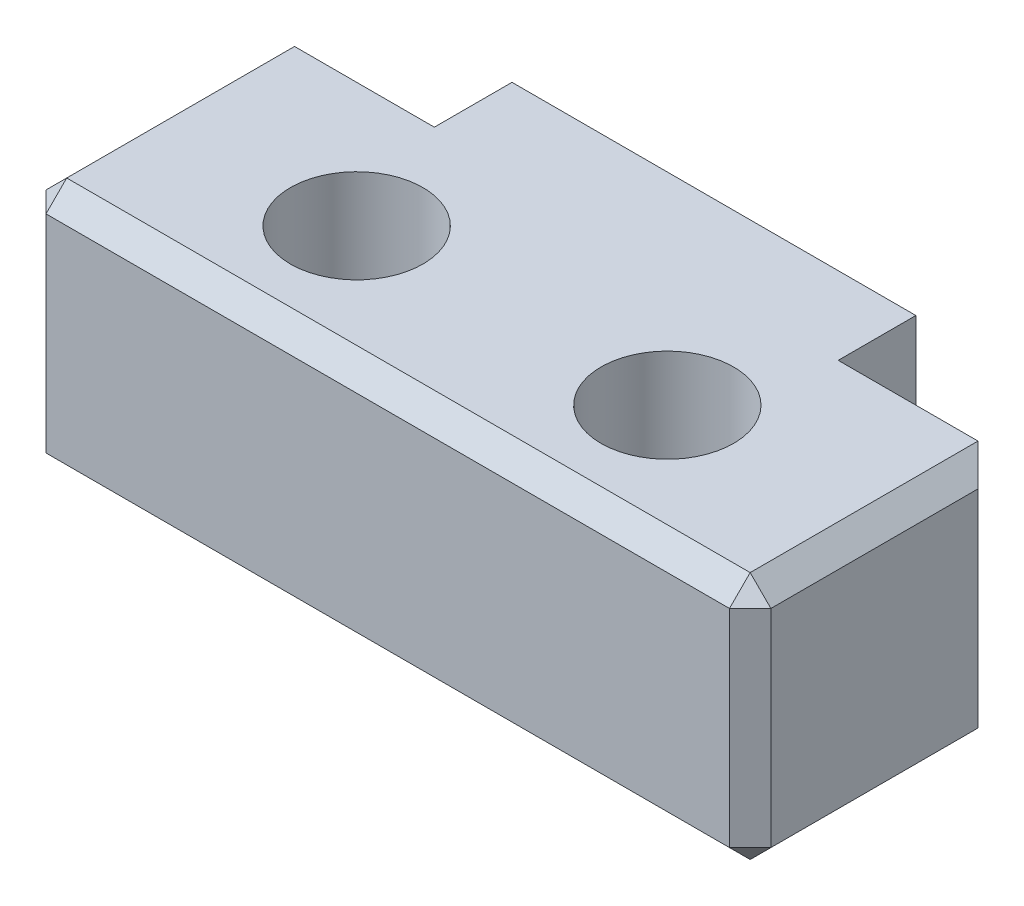
ISO-10303-21;
HEADER;
FILE_DESCRIPTION(('STEP AP214'),'2;1');
FILE_NAME('part.step','',(''),(''),'','','');
FILE_SCHEMA(('AUTOMOTIVE_DESIGN { 1 0 10303 214 1 1 1 1 }'));
ENDSEC;
DATA;
#1=APPLICATION_CONTEXT('core data for automotive mechanical design processes');
#2=APPLICATION_PROTOCOL_DEFINITION('international standard','automotive_design',2000,#1);
#3=PRODUCT_CONTEXT('',#1,'mechanical');
#4=PRODUCT('Part','Part','',(#3));
#5=PRODUCT_RELATED_PRODUCT_CATEGORY('part','',(#4));
#6=PRODUCT_DEFINITION_FORMATION('','',#4);
#7=PRODUCT_DEFINITION_CONTEXT('part definition',#1,'design');
#8=PRODUCT_DEFINITION('design','',#6,#7);
#9=PRODUCT_DEFINITION_SHAPE('','',#8);
#10=(LENGTH_UNIT() NAMED_UNIT(*) SI_UNIT(.MILLI.,.METRE.));
#11=(NAMED_UNIT(*) PLANE_ANGLE_UNIT() SI_UNIT($,.RADIAN.));
#12=(NAMED_UNIT(*) SI_UNIT($,.STERADIAN.) SOLID_ANGLE_UNIT());
#13=UNCERTAINTY_MEASURE_WITH_UNIT(LENGTH_MEASURE(1.E-05),#10,'distance_accuracy_value','');
#14=(GEOMETRIC_REPRESENTATION_CONTEXT(3) GLOBAL_UNCERTAINTY_ASSIGNED_CONTEXT((#13)) GLOBAL_UNIT_ASSIGNED_CONTEXT((#10,
#11,#12)) REPRESENTATION_CONTEXT('',''));
#15=CARTESIAN_POINT('',(0.,0.,0.));
#16=DIRECTION('',(0.,0.,1.));
#17=DIRECTION('',(1.,0.,0.));
#18=AXIS2_PLACEMENT_3D('',#15,#16,#17);
#19=CARTESIAN_POINT('',(0.,0.,-6.));
#20=DIRECTION('',(0.,0.,-1.));
#21=DIRECTION('',(-1.,0.,0.));
#22=AXIS2_PLACEMENT_3D('',#19,#20,#21);
#23=PLANE('',#22);
#24=DIRECTION('',(-1.,0.,0.));
#25=VECTOR('',#24,1.);
#26=CARTESIAN_POINT('',(-17.5,6.,-6.));
#27=LINE('',#26,#25);
#28=CARTESIAN_POINT('',(16.5,6.,-6.));
#29=VERTEX_POINT('',#28);
#30=CARTESIAN_POINT('',(9.75,6.,-6.));
#31=VERTEX_POINT('',#30);
#32=EDGE_CURVE('E178',#29,#31,#27,.T.);
#33=ORIENTED_EDGE('',*,*,#32,.F.);
#34=DIRECTION('',(0.,-1.,0.));
#35=VECTOR('',#34,1.);
#36=CARTESIAN_POINT('',(16.5,-6.,-6.));
#37=LINE('',#36,#35);
#38=CARTESIAN_POINT('',(16.5,-6.,-6.));
#39=VERTEX_POINT('',#38);
#40=EDGE_CURVE('E211',#29,#39,#37,.T.);
#41=ORIENTED_EDGE('',*,*,#40,.T.);
#42=DIRECTION('',(1.,0.,0.));
#43=VECTOR('',#42,1.);
#44=CARTESIAN_POINT('',(-17.5,-6.,-6.));
#45=LINE('',#44,#43);
#46=CARTESIAN_POINT('',(9.75,-6.,-6.));
#47=VERTEX_POINT('',#46);
#48=EDGE_CURVE('E190',#47,#39,#45,.T.);
#49=ORIENTED_EDGE('',*,*,#48,.F.);
#50=DIRECTION('',(0.,1.,0.));
#51=VECTOR('',#50,1.);
#52=CARTESIAN_POINT('',(9.75,-26.0701893364263,-6.));
#53=LINE('',#52,#51);
#54=EDGE_CURVE('E183',#47,#31,#53,.T.);
#55=ORIENTED_EDGE('',*,*,#54,.T.);
#56=EDGE_LOOP('',(#33,#41,#49,#55));
#57=FACE_BOUND('',#56,.T.);
#58=ADVANCED_FACE('F41',(#57),#23,.T.);
#59=CARTESIAN_POINT('',(17.5,-6.,6.));
#60=DIRECTION('',(-1.,0.,0.));
#61=DIRECTION('',(0.,0.,1.));
#62=AXIS2_PLACEMENT_3D('',#59,#60,#61);
#63=PLANE('',#62);
#64=DIRECTION('',(0.,-1.,0.));
#65=VECTOR('',#64,1.);
#66=CARTESIAN_POINT('',(17.5,-6.,5.));
#67=LINE('',#66,#65);
#68=CARTESIAN_POINT('',(17.5,4.99999999999999,5.));
#69=VERTEX_POINT('',#68);
#70=CARTESIAN_POINT('',(17.5,-5.,5.));
#71=VERTEX_POINT('',#70);
#72=EDGE_CURVE('E193',#69,#71,#67,.T.);
#73=ORIENTED_EDGE('',*,*,#72,.T.);
#74=DIRECTION('',(0.,0.,-1.));
#75=VECTOR('',#74,1.);
#76=CARTESIAN_POINT('',(17.5,-5.,6.));
#77=LINE('',#76,#75);
#78=CARTESIAN_POINT('',(17.5,-5.,-5.));
#79=VERTEX_POINT('',#78);
#80=EDGE_CURVE('E199',#71,#79,#77,.T.);
#81=ORIENTED_EDGE('',*,*,#80,.T.);
#82=DIRECTION('',(0.,1.,0.));
#83=VECTOR('',#82,1.);
#84=CARTESIAN_POINT('',(17.5,6.,-5.));
#85=LINE('',#84,#83);
#86=CARTESIAN_POINT('',(17.5,4.99999999999999,-5.));
#87=VERTEX_POINT('',#86);
#88=EDGE_CURVE('E197',#79,#87,#85,.T.);
#89=ORIENTED_EDGE('',*,*,#88,.T.);
#90=DIRECTION('',(0.,0.,1.));
#91=VECTOR('',#90,1.);
#92=CARTESIAN_POINT('',(17.5,4.99999999999999,6.));
#93=LINE('',#92,#91);
#94=EDGE_CURVE('E195',#87,#69,#93,.T.);
#95=ORIENTED_EDGE('',*,*,#94,.T.);
#96=EDGE_LOOP('',(#73,#81,#89,#95));
#97=FACE_BOUND('',#96,.T.);
#98=ADVANCED_FACE('F326',(#97),#63,.F.);
#99=CARTESIAN_POINT('',(-17.5,6.,6.));
#100=DIRECTION('',(0.,-1.,0.));
#101=DIRECTION('',(0.,0.,-1.));
#102=AXIS2_PLACEMENT_3D('',#99,#100,#101);
#103=PLANE('',#102);
#104=CARTESIAN_POINT('',(-7.5,6.,0.));
#105=DIRECTION('',(0.,1.,0.));
#106=DIRECTION('',(0.,0.,1.));
#107=AXIS2_PLACEMENT_3D('',#104,#105,#106);
#108=CIRCLE('',#107,3.2);
#109=CARTESIAN_POINT('',(-7.5,6.,3.2));
#110=VERTEX_POINT('',#109);
#111=EDGE_CURVE('E292',#110,#110,#108,.T.);
#112=ORIENTED_EDGE('',*,*,#111,.F.);
#113=EDGE_LOOP('',(#112));
#114=FACE_BOUND('',#113,.T.);
#115=CARTESIAN_POINT('',(7.5,6.,0.));
#116=DIRECTION('',(0.,1.,0.));
#117=DIRECTION('',(0.,0.,1.));
#118=AXIS2_PLACEMENT_3D('',#115,#116,#117);
#119=CIRCLE('',#118,3.2);
#120=CARTESIAN_POINT('',(7.5,6.,3.2));
#121=VERTEX_POINT('',#120);
#122=EDGE_CURVE('E399',#121,#121,#119,.T.);
#123=ORIENTED_EDGE('',*,*,#122,.F.);
#124=EDGE_LOOP('',(#123));
#125=FACE_BOUND('',#124,.T.);
#126=DIRECTION('',(1.,0.,0.));
#127=VECTOR('',#126,1.);
#128=CARTESIAN_POINT('',(-17.5,6.,5.));
#129=LINE('',#128,#127);
#130=CARTESIAN_POINT('',(-16.5,6.,5.));
#131=VERTEX_POINT('',#130);
#132=CARTESIAN_POINT('',(16.5,6.,5.));
#133=VERTEX_POINT('',#132);
#134=EDGE_CURVE('E216',#131,#133,#129,.T.);
#135=ORIENTED_EDGE('',*,*,#134,.T.);
#136=DIRECTION('',(0.,0.,-1.));
#137=VECTOR('',#136,1.);
#138=CARTESIAN_POINT('',(16.5,6.,6.));
#139=LINE('',#138,#137);
#140=EDGE_CURVE('E218',#133,#29,#139,.T.);
#141=ORIENTED_EDGE('',*,*,#140,.T.);
#142=ORIENTED_EDGE('',*,*,#32,.T.);
#143=DIRECTION('',(0.,0.,-1.));
#144=VECTOR('',#143,1.);
#145=CARTESIAN_POINT('',(9.75,6.,-6.));
#146=LINE('',#145,#144);
#147=CARTESIAN_POINT('',(9.75,6.,-9.75000000000001));
#148=VERTEX_POINT('',#147);
#149=EDGE_CURVE('E167',#31,#148,#146,.T.);
#150=ORIENTED_EDGE('',*,*,#149,.T.);
#151=DIRECTION('',(-1.,0.,0.));
#152=VECTOR('',#151,1.);
#153=CARTESIAN_POINT('',(-9.75,6.,-9.75000000000001));
#154=LINE('',#153,#152);
#155=CARTESIAN_POINT('',(-9.75,6.,-9.75000000000001));
#156=VERTEX_POINT('',#155);
#157=EDGE_CURVE('E163',#148,#156,#154,.T.);
#158=ORIENTED_EDGE('',*,*,#157,.T.);
#159=DIRECTION('',(0.,0.,1.));
#160=VECTOR('',#159,1.);
#161=CARTESIAN_POINT('',(-9.75,6.,-6.));
#162=LINE('',#161,#160);
#163=CARTESIAN_POINT('',(-9.75,6.,-6.));
#164=VERTEX_POINT('',#163);
#165=EDGE_CURVE('E156',#156,#164,#162,.T.);
#166=ORIENTED_EDGE('',*,*,#165,.T.);
#167=CARTESIAN_POINT('',(-16.5,6.,-6.));
#168=VERTEX_POINT('',#167);
#169=EDGE_CURVE('E159',#164,#168,#27,.T.);
#170=ORIENTED_EDGE('',*,*,#169,.T.);
#171=DIRECTION('',(0.,0.,1.));
#172=VECTOR('',#171,1.);
#173=CARTESIAN_POINT('',(-16.5,6.,6.));
#174=LINE('',#173,#172);
#175=EDGE_CURVE('E214',#168,#131,#174,.T.);
#176=ORIENTED_EDGE('',*,*,#175,.T.);
#177=EDGE_LOOP('',(#135,#141,#142,#150,#158,#166,#170,#176));
#178=FACE_BOUND('',#177,.T.);
#179=ADVANCED_FACE('F158',(#114,#125,#178),#103,.F.);
#180=CARTESIAN_POINT('',(-17.5,-6.,6.));
#181=DIRECTION('',(1.,0.,0.));
#182=DIRECTION('',(0.,0.,-1.));
#183=AXIS2_PLACEMENT_3D('',#180,#181,#182);
#184=PLANE('',#183);
#185=DIRECTION('',(0.,1.,0.));
#186=VECTOR('',#185,1.);
#187=CARTESIAN_POINT('',(-17.5,-6.,5.));
#188=LINE('',#187,#186);
#189=CARTESIAN_POINT('',(-17.5,-5.,5.));
#190=VERTEX_POINT('',#189);
#191=CARTESIAN_POINT('',(-17.5,5.,5.));
#192=VERTEX_POINT('',#191);
#193=EDGE_CURVE('E233',#190,#192,#188,.T.);
#194=ORIENTED_EDGE('',*,*,#193,.T.);
#195=DIRECTION('',(0.,0.,-1.));
#196=VECTOR('',#195,1.);
#197=CARTESIAN_POINT('',(-17.5,5.,6.));
#198=LINE('',#197,#196);
#199=CARTESIAN_POINT('',(-17.5,5.,-5.));
#200=VERTEX_POINT('',#199);
#201=EDGE_CURVE('E235',#192,#200,#198,.T.);
#202=ORIENTED_EDGE('',*,*,#201,.T.);
#203=DIRECTION('',(0.,-1.,0.));
#204=VECTOR('',#203,1.);
#205=CARTESIAN_POINT('',(-17.5,-6.,-5.));
#206=LINE('',#205,#204);
#207=CARTESIAN_POINT('',(-17.5,-5.,-5.));
#208=VERTEX_POINT('',#207);
#209=EDGE_CURVE('E229',#200,#208,#206,.T.);
#210=ORIENTED_EDGE('',*,*,#209,.T.);
#211=DIRECTION('',(0.,0.,1.));
#212=VECTOR('',#211,1.);
#213=CARTESIAN_POINT('',(-17.5,-5.,6.));
#214=LINE('',#213,#212);
#215=EDGE_CURVE('E231',#208,#190,#214,.T.);
#216=ORIENTED_EDGE('',*,*,#215,.T.);
#217=EDGE_LOOP('',(#194,#202,#210,#216));
#218=FACE_BOUND('',#217,.T.);
#219=ADVANCED_FACE('F348',(#218),#184,.F.);
#220=CARTESIAN_POINT('',(-17.5,-6.,6.));
#221=DIRECTION('',(0.,1.,0.));
#222=DIRECTION('',(0.,0.,1.));
#223=AXIS2_PLACEMENT_3D('',#220,#221,#222);
#224=PLANE('',#223);
#225=CARTESIAN_POINT('',(-7.5,-6.,0.));
#226=DIRECTION('',(0.,1.,0.));
#227=DIRECTION('',(0.,0.,1.));
#228=AXIS2_PLACEMENT_3D('',#225,#226,#227);
#229=CIRCLE('',#228,3.2);
#230=CARTESIAN_POINT('',(-7.5,-6.,3.2));
#231=VERTEX_POINT('',#230);
#232=EDGE_CURVE('E402',#231,#231,#229,.T.);
#233=ORIENTED_EDGE('',*,*,#232,.T.);
#234=EDGE_LOOP('',(#233));
#235=FACE_BOUND('',#234,.T.);
#236=CARTESIAN_POINT('',(7.5,-6.,0.));
#237=DIRECTION('',(0.,1.,0.));
#238=DIRECTION('',(0.,0.,1.));
#239=AXIS2_PLACEMENT_3D('',#236,#237,#238);
#240=CIRCLE('',#239,3.2);
#241=CARTESIAN_POINT('',(7.5,-6.,3.2));
#242=VERTEX_POINT('',#241);
#243=EDGE_CURVE('E168',#242,#242,#240,.T.);
#244=ORIENTED_EDGE('',*,*,#243,.T.);
#245=EDGE_LOOP('',(#244));
#246=FACE_BOUND('',#245,.T.);
#247=ORIENTED_EDGE('',*,*,#48,.T.);
#248=DIRECTION('',(0.,0.,1.));
#249=VECTOR('',#248,1.);
#250=CARTESIAN_POINT('',(16.5,-6.,6.));
#251=LINE('',#250,#249);
#252=CARTESIAN_POINT('',(16.5,-6.,5.));
#253=VERTEX_POINT('',#252);
#254=EDGE_CURVE('E208',#39,#253,#251,.T.);
#255=ORIENTED_EDGE('',*,*,#254,.T.);
#256=DIRECTION('',(-1.,0.,0.));
#257=VECTOR('',#256,1.);
#258=CARTESIAN_POINT('',(-17.5,-6.,5.));
#259=LINE('',#258,#257);
#260=CARTESIAN_POINT('',(-16.5,-6.,5.));
#261=VERTEX_POINT('',#260);
#262=EDGE_CURVE('E206',#253,#261,#259,.T.);
#263=ORIENTED_EDGE('',*,*,#262,.T.);
#264=DIRECTION('',(0.,0.,-1.));
#265=VECTOR('',#264,1.);
#266=CARTESIAN_POINT('',(-16.5,-6.,6.));
#267=LINE('',#266,#265);
#268=CARTESIAN_POINT('',(-16.5,-6.,-6.));
#269=VERTEX_POINT('',#268);
#270=EDGE_CURVE('E204',#261,#269,#267,.T.);
#271=ORIENTED_EDGE('',*,*,#270,.T.);
#272=CARTESIAN_POINT('',(-9.75,-6.,-6.));
#273=VERTEX_POINT('',#272);
#274=EDGE_CURVE('E191',#269,#273,#45,.T.);
#275=ORIENTED_EDGE('',*,*,#274,.T.);
#276=DIRECTION('',(0.,0.,-1.));
#277=VECTOR('',#276,1.);
#278=CARTESIAN_POINT('',(-9.75,-6.,-6.));
#279=LINE('',#278,#277);
#280=CARTESIAN_POINT('',(-9.75,-6.,-9.75000000000001));
#281=VERTEX_POINT('',#280);
#282=EDGE_CURVE('E179',#273,#281,#279,.T.);
#283=ORIENTED_EDGE('',*,*,#282,.T.);
#284=DIRECTION('',(1.,0.,0.));
#285=VECTOR('',#284,1.);
#286=CARTESIAN_POINT('',(9.75,-6.,-9.75000000000001));
#287=LINE('',#286,#285);
#288=CARTESIAN_POINT('',(9.75,-6.,-9.75000000000001));
#289=VERTEX_POINT('',#288);
#290=EDGE_CURVE('E202',#281,#289,#287,.T.);
#291=ORIENTED_EDGE('',*,*,#290,.T.);
#292=DIRECTION('',(0.,0.,1.));
#293=VECTOR('',#292,1.);
#294=CARTESIAN_POINT('',(9.75,-6.,-6.));
#295=LINE('',#294,#293);
#296=EDGE_CURVE('E186',#289,#47,#295,.T.);
#297=ORIENTED_EDGE('',*,*,#296,.T.);
#298=EDGE_LOOP('',(#247,#255,#263,#271,#275,#283,#291,#297));
#299=FACE_BOUND('',#298,.T.);
#300=ADVANCED_FACE('F343',(#235,#246,#299),#224,.F.);
#301=CARTESIAN_POINT('',(0.,0.,6.));
#302=DIRECTION('',(0.,0.,-1.));
#303=DIRECTION('',(-1.,0.,0.));
#304=AXIS2_PLACEMENT_3D('',#301,#302,#303);
#305=PLANE('',#304);
#306=DIRECTION('',(0.,-1.,0.));
#307=VECTOR('',#306,1.);
#308=CARTESIAN_POINT('',(-16.5,0.,6.));
#309=LINE('',#308,#307);
#310=CARTESIAN_POINT('',(-16.5,5.,6.));
#311=VERTEX_POINT('',#310);
#312=CARTESIAN_POINT('',(-16.5,-5.,6.));
#313=VERTEX_POINT('',#312);
#314=EDGE_CURVE('E220',#311,#313,#309,.T.);
#315=ORIENTED_EDGE('',*,*,#314,.T.);
#316=DIRECTION('',(1.,0.,0.));
#317=VECTOR('',#316,1.);
#318=CARTESIAN_POINT('',(0.,-5.,6.));
#319=LINE('',#318,#317);
#320=CARTESIAN_POINT('',(16.5,-5.,6.));
#321=VERTEX_POINT('',#320);
#322=EDGE_CURVE('E226',#313,#321,#319,.T.);
#323=ORIENTED_EDGE('',*,*,#322,.T.);
#324=DIRECTION('',(0.,1.,0.));
#325=VECTOR('',#324,1.);
#326=CARTESIAN_POINT('',(16.5,0.,6.));
#327=LINE('',#326,#325);
#328=CARTESIAN_POINT('',(16.5,5.,6.));
#329=VERTEX_POINT('',#328);
#330=EDGE_CURVE('E224',#321,#329,#327,.T.);
#331=ORIENTED_EDGE('',*,*,#330,.T.);
#332=DIRECTION('',(-1.,0.,0.));
#333=VECTOR('',#332,1.);
#334=CARTESIAN_POINT('',(0.,5.,6.));
#335=LINE('',#334,#333);
#336=EDGE_CURVE('E222',#329,#311,#335,.T.);
#337=ORIENTED_EDGE('',*,*,#336,.T.);
#338=EDGE_LOOP('',(#315,#323,#331,#337));
#339=FACE_BOUND('',#338,.T.);
#340=ADVANCED_FACE('F339',(#339),#305,.F.);
#341=ORIENTED_EDGE('',*,*,#274,.F.);
#342=DIRECTION('',(0.,1.,0.));
#343=VECTOR('',#342,1.);
#344=CARTESIAN_POINT('',(-16.5,6.,-6.));
#345=LINE('',#344,#343);
#346=EDGE_CURVE('E177',#269,#168,#345,.T.);
#347=ORIENTED_EDGE('',*,*,#346,.T.);
#348=ORIENTED_EDGE('',*,*,#169,.F.);
#349=DIRECTION('',(0.,1.,0.));
#350=VECTOR('',#349,1.);
#351=CARTESIAN_POINT('',(-9.75,-26.0701893364263,-6.));
#352=LINE('',#351,#350);
#353=EDGE_CURVE('E174',#273,#164,#352,.T.);
#354=ORIENTED_EDGE('',*,*,#353,.F.);
#355=EDGE_LOOP('',(#341,#347,#348,#354));
#356=FACE_BOUND('',#355,.T.);
#357=ADVANCED_FACE('F173',(#356),#23,.T.);
#358=CARTESIAN_POINT('',(-9.75,-26.0701893364263,-6.));
#359=DIRECTION('',(-1.,0.,0.));
#360=DIRECTION('',(0.,0.,1.));
#361=AXIS2_PLACEMENT_3D('',#358,#359,#360);
#362=PLANE('',#361);
#363=ORIENTED_EDGE('',*,*,#165,.F.);
#364=DIRECTION('',(0.,-1.,0.));
#365=VECTOR('',#364,1.);
#366=CARTESIAN_POINT('',(-9.75,-26.0701893364263,-9.75000000000001));
#367=LINE('',#366,#365);
#368=EDGE_CURVE('E11',#156,#281,#367,.T.);
#369=ORIENTED_EDGE('',*,*,#368,.T.);
#370=ORIENTED_EDGE('',*,*,#282,.F.);
#371=ORIENTED_EDGE('',*,*,#353,.T.);
#372=EDGE_LOOP('',(#363,#369,#370,#371));
#373=FACE_BOUND('',#372,.T.);
#374=ADVANCED_FACE('F181',(#373),#362,.T.);
#375=CARTESIAN_POINT('',(-9.75,-26.0701893364263,-10.75));
#376=DIRECTION('',(0.,0.,-1.));
#377=DIRECTION('',(-1.,0.,0.));
#378=AXIS2_PLACEMENT_3D('',#375,#376,#377);
#379=PLANE('',#378);
#380=DIRECTION('',(1.,0.,0.));
#381=VECTOR('',#380,1.);
#382=CARTESIAN_POINT('',(9.75,5.,-10.75));
#383=LINE('',#382,#381);
#384=CARTESIAN_POINT('',(-8.75,5.,-10.75));
#385=VERTEX_POINT('',#384);
#386=CARTESIAN_POINT('',(8.75,5.,-10.75));
#387=VERTEX_POINT('',#386);
#388=EDGE_CURVE('E59',#385,#387,#383,.T.);
#389=ORIENTED_EDGE('',*,*,#388,.T.);
#390=DIRECTION('',(0.,-1.,0.));
#391=VECTOR('',#390,1.);
#392=CARTESIAN_POINT('',(8.75,-26.0701893364263,-10.75));
#393=LINE('',#392,#391);
#394=CARTESIAN_POINT('',(8.75,-5.,-10.75));
#395=VERTEX_POINT('',#394);
#396=EDGE_CURVE('E51',#387,#395,#393,.T.);
#397=ORIENTED_EDGE('',*,*,#396,.T.);
#398=DIRECTION('',(-1.,0.,0.));
#399=VECTOR('',#398,1.);
#400=CARTESIAN_POINT('',(-9.75,-5.,-10.75));
#401=LINE('',#400,#399);
#402=CARTESIAN_POINT('',(-8.75,-5.,-10.75));
#403=VERTEX_POINT('',#402);
#404=EDGE_CURVE('E242',#395,#403,#401,.T.);
#405=ORIENTED_EDGE('',*,*,#404,.T.);
#406=DIRECTION('',(0.,1.,0.));
#407=VECTOR('',#406,1.);
#408=CARTESIAN_POINT('',(-8.75,-26.0701893364263,-10.75));
#409=LINE('',#408,#407);
#410=EDGE_CURVE('E64',#403,#385,#409,.T.);
#411=ORIENTED_EDGE('',*,*,#410,.T.);
#412=EDGE_LOOP('',(#389,#397,#405,#411));
#413=FACE_BOUND('',#412,.T.);
#414=ADVANCED_FACE('F312',(#413),#379,.T.);
#415=CARTESIAN_POINT('',(9.75,-26.0701893364263,-6.));
#416=DIRECTION('',(1.,0.,0.));
#417=DIRECTION('',(0.,0.,-1.));
#418=AXIS2_PLACEMENT_3D('',#415,#416,#417);
#419=PLANE('',#418);
#420=ORIENTED_EDGE('',*,*,#296,.F.);
#421=DIRECTION('',(0.,1.,0.));
#422=VECTOR('',#421,1.);
#423=CARTESIAN_POINT('',(9.75,-26.0701893364263,-9.75000000000001));
#424=LINE('',#423,#422);
#425=EDGE_CURVE('E239',#289,#148,#424,.T.);
#426=ORIENTED_EDGE('',*,*,#425,.T.);
#427=ORIENTED_EDGE('',*,*,#149,.F.);
#428=ORIENTED_EDGE('',*,*,#54,.F.);
#429=EDGE_LOOP('',(#420,#426,#427,#428));
#430=FACE_BOUND('',#429,.T.);
#431=ADVANCED_FACE('F314',(#430),#419,.T.);
#432=CARTESIAN_POINT('',(7.5,6.,0.));
#433=DIRECTION('',(0.,1.,0.));
#434=DIRECTION('',(0.,0.,1.));
#435=AXIS2_PLACEMENT_3D('',#432,#433,#434);
#436=CYLINDRICAL_SURFACE('',#435,3.2);
#437=ORIENTED_EDGE('',*,*,#243,.F.);
#438=EDGE_LOOP('',(#437));
#439=FACE_BOUND('',#438,.T.);
#440=ORIENTED_EDGE('',*,*,#122,.T.);
#441=EDGE_LOOP('',(#440));
#442=FACE_BOUND('',#441,.T.);
#443=ADVANCED_FACE('F320',(#439,#442),#436,.F.);
#444=CARTESIAN_POINT('',(-7.5,6.,0.));
#445=DIRECTION('',(0.,1.,0.));
#446=DIRECTION('',(0.,0.,1.));
#447=AXIS2_PLACEMENT_3D('',#444,#445,#446);
#448=CYLINDRICAL_SURFACE('',#447,3.2);
#449=ORIENTED_EDGE('',*,*,#232,.F.);
#450=EDGE_LOOP('',(#449));
#451=FACE_BOUND('',#450,.T.);
#452=ORIENTED_EDGE('',*,*,#111,.T.);
#453=EDGE_LOOP('',(#452));
#454=FACE_BOUND('',#453,.T.);
#455=ADVANCED_FACE('F408',(#451,#454),#448,.F.);
#456=CARTESIAN_POINT('',(-17.5,5.,6.));
#457=DIRECTION('',(0.707106781186546,-0.707106781186549,0.));
#458=DIRECTION('',(0.,0.,-1.));
#459=AXIS2_PLACEMENT_3D('',#456,#457,#458);
#460=PLANE('',#459);
#461=DIRECTION('',(0.707106781186549,0.707106781186546,0.));
#462=VECTOR('',#461,1.);
#463=CARTESIAN_POINT('',(-17.,5.5,5.));
#464=LINE('',#463,#462);
#465=EDGE_CURVE('E286',#131,#192,#464,.F.);
#466=ORIENTED_EDGE('',*,*,#465,.F.);
#467=ORIENTED_EDGE('',*,*,#175,.F.);
#468=DIRECTION('',(-0.577350269189627,-0.577350269189625,0.577350269189625));
#469=VECTOR('',#468,1.);
#470=CARTESIAN_POINT('',(-21.1666666666667,1.33333333333334,-1.33333333333334));
#471=LINE('',#470,#469);
#472=EDGE_CURVE('E289',#200,#168,#471,.F.);
#473=ORIENTED_EDGE('',*,*,#472,.F.);
#474=ORIENTED_EDGE('',*,*,#201,.F.);
#475=EDGE_LOOP('',(#466,#467,#473,#474));
#476=FACE_BOUND('',#475,.T.);
#477=ADVANCED_FACE('F419',(#476),#460,.F.);
#478=CARTESIAN_POINT('',(-17.5,-6.,-5.));
#479=DIRECTION('',(-0.707106781186546,0.,-0.707106781186549));
#480=DIRECTION('',(0.,1.,0.));
#481=AXIS2_PLACEMENT_3D('',#478,#479,#480);
#482=PLANE('',#481);
#483=ORIENTED_EDGE('',*,*,#472,.T.);
#484=ORIENTED_EDGE('',*,*,#346,.F.);
#485=DIRECTION('',(0.577350269189627,-0.577350269189625,-0.577350269189625));
#486=VECTOR('',#485,1.);
#487=CARTESIAN_POINT('',(-17.1666666666667,-5.33333333333333,-5.33333333333333));
#488=LINE('',#487,#486);
#489=EDGE_CURVE('E283',#208,#269,#488,.T.);
#490=ORIENTED_EDGE('',*,*,#489,.F.);
#491=ORIENTED_EDGE('',*,*,#209,.F.);
#492=EDGE_LOOP('',(#483,#484,#490,#491));
#493=FACE_BOUND('',#492,.T.);
#494=ADVANCED_FACE('F498',(#493),#482,.T.);
#495=CARTESIAN_POINT('',(-16.5,5.,6.));
#496=DIRECTION('',(-0.577350269189624,0.577350269189628,0.577350269189626));
#497=DIRECTION('',(0.,-0.707106781186546,0.707106781186549));
#498=AXIS2_PLACEMENT_3D('',#495,#496,#497);
#499=PLANE('',#498);
#500=DIRECTION('',(0.,-0.707106781186546,0.707106781186549));
#501=VECTOR('',#500,1.);
#502=CARTESIAN_POINT('',(-16.5,5.,6.));
#503=LINE('',#502,#501);
#504=EDGE_CURVE('E277',#131,#311,#503,.T.);
#505=ORIENTED_EDGE('',*,*,#504,.F.);
#506=ORIENTED_EDGE('',*,*,#465,.T.);
#507=DIRECTION('',(-0.707106781186549,0.,-0.707106781186546));
#508=VECTOR('',#507,1.);
#509=CARTESIAN_POINT('',(-16.5,5.,6.));
#510=LINE('',#509,#508);
#511=EDGE_CURVE('E280',#311,#192,#510,.T.);
#512=ORIENTED_EDGE('',*,*,#511,.F.);
#513=EDGE_LOOP('',(#505,#506,#512));
#514=FACE_BOUND('',#513,.T.);
#515=ADVANCED_FACE('F491',(#514),#499,.T.);
#516=CARTESIAN_POINT('',(-16.5,-6.,6.));
#517=DIRECTION('',(0.707106781186546,0.707106781186549,0.));
#518=DIRECTION('',(0.,0.,-1.));
#519=AXIS2_PLACEMENT_3D('',#516,#517,#518);
#520=PLANE('',#519);
#521=ORIENTED_EDGE('',*,*,#489,.T.);
#522=ORIENTED_EDGE('',*,*,#270,.F.);
#523=DIRECTION('',(-0.707106781186549,0.707106781186546,0.));
#524=VECTOR('',#523,1.);
#525=CARTESIAN_POINT('',(-16.5,-6.,5.));
#526=LINE('',#525,#524);
#527=EDGE_CURVE('E274',#190,#261,#526,.F.);
#528=ORIENTED_EDGE('',*,*,#527,.F.);
#529=ORIENTED_EDGE('',*,*,#215,.F.);
#530=EDGE_LOOP('',(#521,#522,#528,#529));
#531=FACE_BOUND('',#530,.T.);
#532=ADVANCED_FACE('F485',(#531),#520,.F.);
#533=CARTESIAN_POINT('',(-16.5,0.,6.));
#534=DIRECTION('',(0.707106781186546,0.,-0.707106781186549));
#535=DIRECTION('',(0.,-1.,0.));
#536=AXIS2_PLACEMENT_3D('',#533,#534,#535);
#537=PLANE('',#536);
#538=ORIENTED_EDGE('',*,*,#511,.T.);
#539=ORIENTED_EDGE('',*,*,#193,.F.);
#540=DIRECTION('',(0.707106781186549,0.,0.707106781186546));
#541=VECTOR('',#540,1.);
#542=CARTESIAN_POINT('',(-17.,-5.,5.5));
#543=LINE('',#542,#541);
#544=EDGE_CURVE('E271',#313,#190,#543,.F.);
#545=ORIENTED_EDGE('',*,*,#544,.F.);
#546=ORIENTED_EDGE('',*,*,#314,.F.);
#547=EDGE_LOOP('',(#538,#539,#545,#546));
#548=FACE_BOUND('',#547,.T.);
#549=ADVANCED_FACE('F357',(#548),#537,.F.);
#550=CARTESIAN_POINT('',(0.,5.,6.));
#551=DIRECTION('',(0.,-0.707106781186549,-0.707106781186546));
#552=DIRECTION('',(-1.,0.,0.));
#553=AXIS2_PLACEMENT_3D('',#550,#551,#552);
#554=PLANE('',#553);
#555=ORIENTED_EDGE('',*,*,#504,.T.);
#556=ORIENTED_EDGE('',*,*,#336,.F.);
#557=DIRECTION('',(0.,0.707106781186546,-0.707106781186549));
#558=VECTOR('',#557,1.);
#559=CARTESIAN_POINT('',(16.5,5.5,5.5));
#560=LINE('',#559,#558);
#561=EDGE_CURVE('E268',#133,#329,#560,.F.);
#562=ORIENTED_EDGE('',*,*,#561,.F.);
#563=ORIENTED_EDGE('',*,*,#134,.F.);
#564=EDGE_LOOP('',(#555,#556,#562,#563));
#565=FACE_BOUND('',#564,.T.);
#566=ADVANCED_FACE('F375',(#565),#554,.F.);
#567=CARTESIAN_POINT('',(-16.5,-6.,5.));
#568=DIRECTION('',(-0.577350269189624,-0.577350269189628,0.577350269189626));
#569=DIRECTION('',(0.,-0.707106781186546,-0.707106781186549));
#570=AXIS2_PLACEMENT_3D('',#567,#568,#569);
#571=PLANE('',#570);
#572=ORIENTED_EDGE('',*,*,#544,.T.);
#573=ORIENTED_EDGE('',*,*,#527,.T.);
#574=DIRECTION('',(0.,-0.707106781186546,-0.707106781186549));
#575=VECTOR('',#574,1.);
#576=CARTESIAN_POINT('',(-16.5,-6.,5.));
#577=LINE('',#576,#575);
#578=EDGE_CURVE('E265',#313,#261,#577,.T.);
#579=ORIENTED_EDGE('',*,*,#578,.F.);
#580=EDGE_LOOP('',(#572,#573,#579));
#581=FACE_BOUND('',#580,.T.);
#582=ADVANCED_FACE('F360',(#581),#571,.T.);
#583=CARTESIAN_POINT('',(17.5,4.99999999999999,5.));
#584=DIRECTION('',(0.577350269189628,0.577350269189626,0.577350269189624));
#585=DIRECTION('',(-0.707106781186546,0.707106781186549,0.));
#586=AXIS2_PLACEMENT_3D('',#583,#584,#585);
#587=PLANE('',#586);
#588=DIRECTION('',(0.707106781186546,-0.707106781186549,0.));
#589=VECTOR('',#588,1.);
#590=CARTESIAN_POINT('',(17.5,4.99999999999999,5.));
#591=LINE('',#590,#589);
#592=EDGE_CURVE('E259',#133,#69,#591,.T.);
#593=ORIENTED_EDGE('',*,*,#592,.F.);
#594=ORIENTED_EDGE('',*,*,#561,.T.);
#595=DIRECTION('',(-0.707106781186546,0.,0.707106781186549));
#596=VECTOR('',#595,1.);
#597=CARTESIAN_POINT('',(17.5,4.99999999999999,5.));
#598=LINE('',#597,#596);
#599=EDGE_CURVE('E262',#69,#329,#598,.T.);
#600=ORIENTED_EDGE('',*,*,#599,.F.);
#601=EDGE_LOOP('',(#593,#594,#600));
#602=FACE_BOUND('',#601,.T.);
#603=ADVANCED_FACE('F381',(#602),#587,.T.);
#604=CARTESIAN_POINT('',(0.,-5.,6.));
#605=DIRECTION('',(0.,0.707106781186549,-0.707106781186546));
#606=DIRECTION('',(1.,0.,0.));
#607=AXIS2_PLACEMENT_3D('',#604,#605,#606);
#608=PLANE('',#607);
#609=ORIENTED_EDGE('',*,*,#578,.T.);
#610=ORIENTED_EDGE('',*,*,#262,.F.);
#611=DIRECTION('',(0.,0.707106781186546,0.707106781186549));
#612=VECTOR('',#611,1.);
#613=CARTESIAN_POINT('',(16.5,-6.,5.));
#614=LINE('',#613,#612);
#615=EDGE_CURVE('E256',#321,#253,#614,.F.);
#616=ORIENTED_EDGE('',*,*,#615,.F.);
#617=ORIENTED_EDGE('',*,*,#322,.F.);
#618=EDGE_LOOP('',(#609,#610,#616,#617));
#619=FACE_BOUND('',#618,.T.);
#620=ADVANCED_FACE('F364',(#619),#608,.F.);
#621=CARTESIAN_POINT('',(16.5,0.,6.));
#622=DIRECTION('',(-0.707106781186549,0.,-0.707106781186546));
#623=DIRECTION('',(0.,1.,0.));
#624=AXIS2_PLACEMENT_3D('',#621,#622,#623);
#625=PLANE('',#624);
#626=ORIENTED_EDGE('',*,*,#599,.T.);
#627=ORIENTED_EDGE('',*,*,#330,.F.);
#628=DIRECTION('',(0.707106781186546,0.,-0.707106781186549));
#629=VECTOR('',#628,1.);
#630=CARTESIAN_POINT('',(17.,-5.,5.5));
#631=LINE('',#630,#629);
#632=EDGE_CURVE('E254',#71,#321,#631,.F.);
#633=ORIENTED_EDGE('',*,*,#632,.F.);
#634=ORIENTED_EDGE('',*,*,#72,.F.);
#635=EDGE_LOOP('',(#626,#627,#633,#634));
#636=FACE_BOUND('',#635,.T.);
#637=ADVANCED_FACE('F370',(#636),#625,.F.);
#638=CARTESIAN_POINT('',(16.5,6.,6.));
#639=DIRECTION('',(-0.707106781186549,-0.707106781186546,0.));
#640=DIRECTION('',(0.,0.,-1.));
#641=AXIS2_PLACEMENT_3D('',#638,#639,#640);
#642=PLANE('',#641);
#643=ORIENTED_EDGE('',*,*,#592,.T.);
#644=ORIENTED_EDGE('',*,*,#94,.F.);
#645=DIRECTION('',(0.577350269189626,-0.577350269189628,0.577350269189624));
#646=VECTOR('',#645,1.);
#647=CARTESIAN_POINT('',(20.5,2.,-2.00000000000003));
#648=LINE('',#647,#646);
#649=EDGE_CURVE('E251',#29,#87,#648,.T.);
#650=ORIENTED_EDGE('',*,*,#649,.F.);
#651=ORIENTED_EDGE('',*,*,#140,.F.);
#652=EDGE_LOOP('',(#643,#644,#650,#651));
#653=FACE_BOUND('',#652,.T.);
#654=ADVANCED_FACE('F386',(#653),#642,.F.);
#655=CARTESIAN_POINT('',(16.5,-6.,5.));
#656=DIRECTION('',(0.577350269189626,-0.577350269189626,0.577350269189624));
#657=DIRECTION('',(0.707106781186547,0.707106781186547,0.));
#658=AXIS2_PLACEMENT_3D('',#655,#656,#657);
#659=PLANE('',#658);
#660=ORIENTED_EDGE('',*,*,#632,.T.);
#661=ORIENTED_EDGE('',*,*,#615,.T.);
#662=DIRECTION('',(-0.707106781186547,-0.707106781186547,0.));
#663=VECTOR('',#662,1.);
#664=CARTESIAN_POINT('',(16.5,-6.,5.));
#665=LINE('',#664,#663);
#666=EDGE_CURVE('E249',#71,#253,#665,.T.);
#667=ORIENTED_EDGE('',*,*,#666,.F.);
#668=EDGE_LOOP('',(#660,#661,#667));
#669=FACE_BOUND('',#668,.T.);
#670=ADVANCED_FACE('F433',(#669),#659,.T.);
#671=CARTESIAN_POINT('',(17.5,-6.,-5.));
#672=DIRECTION('',(0.707106781186546,0.,-0.707106781186549));
#673=DIRECTION('',(0.,-1.,0.));
#674=AXIS2_PLACEMENT_3D('',#671,#672,#673);
#675=PLANE('',#674);
#676=ORIENTED_EDGE('',*,*,#649,.T.);
#677=ORIENTED_EDGE('',*,*,#88,.F.);
#678=DIRECTION('',(0.577350269189626,0.577350269189626,0.577350269189624));
#679=VECTOR('',#678,1.);
#680=CARTESIAN_POINT('',(17.1666666666667,-5.33333333333334,-5.33333333333333));
#681=LINE('',#680,#679);
#682=EDGE_CURVE('E247',#39,#79,#681,.T.);
#683=ORIENTED_EDGE('',*,*,#682,.F.);
#684=ORIENTED_EDGE('',*,*,#40,.F.);
#685=EDGE_LOOP('',(#676,#677,#683,#684));
#686=FACE_BOUND('',#685,.T.);
#687=ADVANCED_FACE('F431',(#686),#675,.T.);
#688=CARTESIAN_POINT('',(17.5,-5.,6.));
#689=DIRECTION('',(-0.707106781186547,0.707106781186547,0.));
#690=DIRECTION('',(0.,0.,-1.));
#691=AXIS2_PLACEMENT_3D('',#688,#689,#690);
#692=PLANE('',#691);
#693=ORIENTED_EDGE('',*,*,#666,.T.);
#694=ORIENTED_EDGE('',*,*,#254,.F.);
#695=ORIENTED_EDGE('',*,*,#682,.T.);
#696=ORIENTED_EDGE('',*,*,#80,.F.);
#697=EDGE_LOOP('',(#693,#694,#695,#696));
#698=FACE_BOUND('',#697,.T.);
#699=ADVANCED_FACE('F427',(#698),#692,.F.);
#700=CARTESIAN_POINT('',(-8.75,-26.0701893364263,-10.75));
#701=DIRECTION('',(0.707106781186545,0.,0.70710678118655));
#702=DIRECTION('',(0.,1.,0.));
#703=AXIS2_PLACEMENT_3D('',#700,#701,#702);
#704=PLANE('',#703);
#705=DIRECTION('',(-0.577350269189627,0.577350269189627,0.577350269189623));
#706=VECTOR('',#705,1.);
#707=CARTESIAN_POINT('',(1.60672977880882,-5.35672977880883,-21.1067297788087));
#708=LINE('',#707,#706);
#709=EDGE_CURVE('E296',#385,#156,#708,.T.);
#710=ORIENTED_EDGE('',*,*,#709,.F.);
#711=ORIENTED_EDGE('',*,*,#410,.F.);
#712=DIRECTION('',(-0.577350269189627,-0.577350269189628,0.577350269189623));
#713=VECTOR('',#712,1.);
#714=CARTESIAN_POINT('',(-12.3333333333333,-8.58333333333335,-7.16666666666668));
#715=LINE('',#714,#713);
#716=EDGE_CURVE('E46',#281,#403,#715,.F.);
#717=ORIENTED_EDGE('',*,*,#716,.F.);
#718=ORIENTED_EDGE('',*,*,#368,.F.);
#719=EDGE_LOOP('',(#710,#711,#717,#718));
#720=FACE_BOUND('',#719,.T.);
#721=ADVANCED_FACE('F44',(#720),#704,.F.);
#722=CARTESIAN_POINT('',(-17.5,-6.,-9.75000000000001));
#723=DIRECTION('',(0.,-0.707106781186544,-0.707106781186551));
#724=DIRECTION('',(-1.,0.,0.));
#725=AXIS2_PLACEMENT_3D('',#722,#723,#724);
#726=PLANE('',#725);
#727=ORIENTED_EDGE('',*,*,#716,.T.);
#728=ORIENTED_EDGE('',*,*,#404,.F.);
#729=DIRECTION('',(-0.577350269189626,0.577350269189629,-0.577350269189623));
#730=VECTOR('',#729,1.);
#731=CARTESIAN_POINT('',(0.666666666666666,3.08333333333338,-18.8333333333333));
#732=LINE('',#731,#730);
#733=EDGE_CURVE('E295',#289,#395,#732,.T.);
#734=ORIENTED_EDGE('',*,*,#733,.F.);
#735=ORIENTED_EDGE('',*,*,#290,.F.);
#736=EDGE_LOOP('',(#727,#728,#734,#735));
#737=FACE_BOUND('',#736,.T.);
#738=ADVANCED_FACE('F304',(#737),#726,.T.);
#739=CARTESIAN_POINT('',(-17.5,6.,-9.75000000000001));
#740=DIRECTION('',(0.,0.707106781186545,-0.70710678118655));
#741=DIRECTION('',(1.,0.,0.));
#742=AXIS2_PLACEMENT_3D('',#739,#740,#741);
#743=PLANE('',#742);
#744=ORIENTED_EDGE('',*,*,#709,.T.);
#745=ORIENTED_EDGE('',*,*,#157,.F.);
#746=DIRECTION('',(0.577350269189626,0.577350269189628,0.577350269189623));
#747=VECTOR('',#746,1.);
#748=CARTESIAN_POINT('',(0.666666666666652,-3.08333333333338,-18.8333333333333));
#749=LINE('',#748,#747);
#750=EDGE_CURVE('E293',#387,#148,#749,.T.);
#751=ORIENTED_EDGE('',*,*,#750,.F.);
#752=ORIENTED_EDGE('',*,*,#388,.F.);
#753=EDGE_LOOP('',(#744,#745,#751,#752));
#754=FACE_BOUND('',#753,.T.);
#755=ADVANCED_FACE('F308',(#754),#743,.T.);
#756=CARTESIAN_POINT('',(9.75,-26.0701893364263,-9.75000000000001));
#757=DIRECTION('',(-0.707106781186546,0.,0.707106781186549));
#758=DIRECTION('',(0.,1.,0.));
#759=AXIS2_PLACEMENT_3D('',#756,#757,#758);
#760=PLANE('',#759);
#761=ORIENTED_EDGE('',*,*,#733,.T.);
#762=ORIENTED_EDGE('',*,*,#396,.F.);
#763=ORIENTED_EDGE('',*,*,#750,.T.);
#764=ORIENTED_EDGE('',*,*,#425,.F.);
#765=EDGE_LOOP('',(#761,#762,#763,#764));
#766=FACE_BOUND('',#765,.T.);
#767=ADVANCED_FACE('F311',(#766),#760,.F.);
#768=CLOSED_SHELL('',(#58,#98,#179,#219,#300,#340,#357,#374,#414,#431,#443,#455,#477,#494,#515,
#532,#549,#566,#582,#603,#620,#637,#654,#670,#687,#699,#721,#738,#755,#767));
#769=MANIFOLD_SOLID_BREP('B2',#768);
#770=ADVANCED_BREP_SHAPE_REPRESENTATION('',(#18,#769),#14);
#771=SHAPE_DEFINITION_REPRESENTATION(#9,#770);
ENDSEC;
END-ISO-10303-21;
